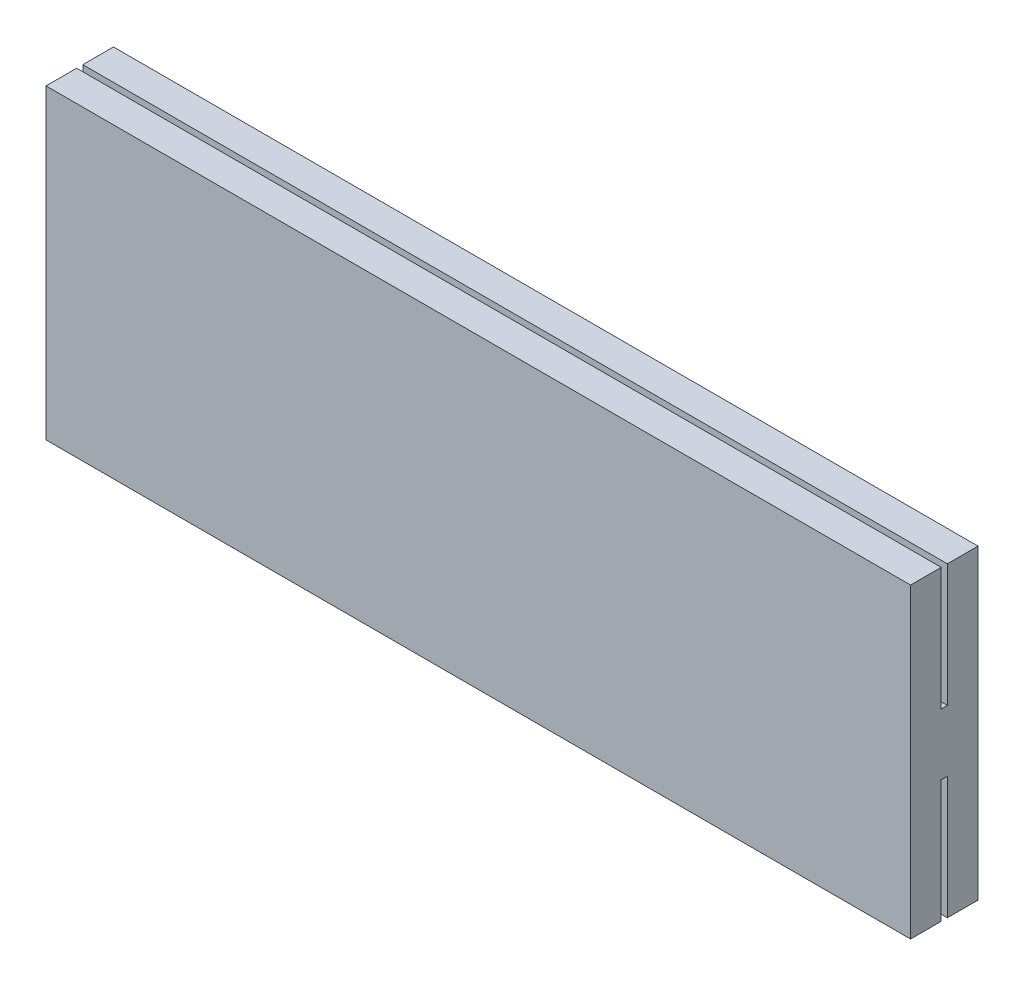
ISO-10303-21;
HEADER;
FILE_DESCRIPTION(('STEP AP214'),'2;1');
FILE_NAME('part.step','',(''),(''),'','','');
FILE_SCHEMA(('AUTOMOTIVE_DESIGN { 1 0 10303 214 1 1 1 1 }'));
ENDSEC;
DATA;
#1=APPLICATION_CONTEXT('core data for automotive mechanical design processes');
#2=APPLICATION_PROTOCOL_DEFINITION('international standard','automotive_design',2000,#1);
#3=PRODUCT_CONTEXT('',#1,'mechanical');
#4=PRODUCT('Part','Part','',(#3));
#5=PRODUCT_RELATED_PRODUCT_CATEGORY('part','',(#4));
#6=PRODUCT_DEFINITION_FORMATION('','',#4);
#7=PRODUCT_DEFINITION_CONTEXT('part definition',#1,'design');
#8=PRODUCT_DEFINITION('design','',#6,#7);
#9=PRODUCT_DEFINITION_SHAPE('','',#8);
#10=(LENGTH_UNIT() NAMED_UNIT(*) SI_UNIT(.MILLI.,.METRE.));
#11=(NAMED_UNIT(*) PLANE_ANGLE_UNIT() SI_UNIT($,.RADIAN.));
#12=(NAMED_UNIT(*) SI_UNIT($,.STERADIAN.) SOLID_ANGLE_UNIT());
#13=UNCERTAINTY_MEASURE_WITH_UNIT(LENGTH_MEASURE(1.E-05),#10,'distance_accuracy_value','');
#14=(GEOMETRIC_REPRESENTATION_CONTEXT(3) GLOBAL_UNCERTAINTY_ASSIGNED_CONTEXT((#13)) GLOBAL_UNIT_ASSIGNED_CONTEXT((#10,
#11,#12)) REPRESENTATION_CONTEXT('',''));
#15=CARTESIAN_POINT('',(0.,0.,0.));
#16=DIRECTION('',(0.,0.,1.));
#17=DIRECTION('',(1.,0.,0.));
#18=AXIS2_PLACEMENT_3D('',#15,#16,#17);
#19=CARTESIAN_POINT('',(293.391405889362,-240.,-12.));
#20=DIRECTION('',(0.,1.,0.));
#21=DIRECTION('',(0.,0.,1.));
#22=AXIS2_PLACEMENT_3D('',#19,#20,#21);
#23=PLANE('',#22);
#24=DIRECTION('',(1.,0.,0.));
#25=VECTOR('',#24,1.);
#26=CARTESIAN_POINT('',(293.391405889362,-240.,-2.00000000000019));
#27=LINE('',#26,#25);
#28=CARTESIAN_POINT('',(-141.,-240.,-2.00000000000176));
#29=VERTEX_POINT('',#28);
#30=CARTESIAN_POINT('',(141.,-240.,-2.00000000000019));
#31=VERTEX_POINT('',#30);
#32=EDGE_CURVE('E123',#29,#31,#27,.T.);
#33=ORIENTED_EDGE('',*,*,#32,.F.);
#34=DIRECTION('',(0.,0.,-1.));
#35=VECTOR('',#34,1.);
#36=CARTESIAN_POINT('',(-141.,-240.,-12.));
#37=LINE('',#36,#35);
#38=CARTESIAN_POINT('',(-141.,-240.,-12.));
#39=VERTEX_POINT('',#38);
#40=EDGE_CURVE('E176',#29,#39,#37,.T.);
#41=ORIENTED_EDGE('',*,*,#40,.T.);
#42=DIRECTION('',(-1.,0.,0.));
#43=VECTOR('',#42,1.);
#44=CARTESIAN_POINT('',(293.391405889362,-240.,-12.));
#45=LINE('',#44,#43);
#46=CARTESIAN_POINT('',(141.,-240.,-12.));
#47=VERTEX_POINT('',#46);
#48=EDGE_CURVE('E172',#47,#39,#45,.T.);
#49=ORIENTED_EDGE('',*,*,#48,.F.);
#50=DIRECTION('',(0.,0.,-1.));
#51=VECTOR('',#50,1.);
#52=CARTESIAN_POINT('',(141.,-240.,-12.));
#53=LINE('',#52,#51);
#54=EDGE_CURVE('E192',#31,#47,#53,.T.);
#55=ORIENTED_EDGE('',*,*,#54,.F.);
#56=EDGE_LOOP('',(#33,#41,#49,#55));
#57=FACE_BOUND('',#56,.T.);
#58=ADVANCED_FACE('F34',(#57),#23,.F.);
#59=CARTESIAN_POINT('',(293.391405889362,-140.,-12.));
#60=DIRECTION('',(0.,-1.,0.));
#61=DIRECTION('',(0.,0.,-1.));
#62=AXIS2_PLACEMENT_3D('',#59,#60,#61);
#63=PLANE('',#62);
#64=DIRECTION('',(-1.,0.,0.));
#65=VECTOR('',#64,1.);
#66=CARTESIAN_POINT('',(293.391405889362,-140.,-2.));
#67=LINE('',#66,#65);
#68=CARTESIAN_POINT('',(141.,-140.,-2.));
#69=VERTEX_POINT('',#68);
#70=CARTESIAN_POINT('',(-141.,-140.,-2.));
#71=VERTEX_POINT('',#70);
#72=EDGE_CURVE('E57',#69,#71,#67,.T.);
#73=ORIENTED_EDGE('',*,*,#72,.F.);
#74=DIRECTION('',(0.,0.,1.));
#75=VECTOR('',#74,1.);
#76=CARTESIAN_POINT('',(141.,-140.,-12.));
#77=LINE('',#76,#75);
#78=CARTESIAN_POINT('',(141.,-140.,-12.));
#79=VERTEX_POINT('',#78);
#80=EDGE_CURVE('E183',#79,#69,#77,.T.);
#81=ORIENTED_EDGE('',*,*,#80,.F.);
#82=DIRECTION('',(-1.,0.,0.));
#83=VECTOR('',#82,1.);
#84=CARTESIAN_POINT('',(293.391405889362,-140.,-12.));
#85=LINE('',#84,#83);
#86=CARTESIAN_POINT('',(-141.,-140.,-12.));
#87=VERTEX_POINT('',#86);
#88=EDGE_CURVE('E193',#79,#87,#85,.T.);
#89=ORIENTED_EDGE('',*,*,#88,.T.);
#90=DIRECTION('',(0.,0.,1.));
#91=VECTOR('',#90,1.);
#92=CARTESIAN_POINT('',(-141.,-140.,-12.));
#93=LINE('',#92,#91);
#94=EDGE_CURVE('E165',#87,#71,#93,.T.);
#95=ORIENTED_EDGE('',*,*,#94,.T.);
#96=EDGE_LOOP('',(#73,#81,#89,#95));
#97=FACE_BOUND('',#96,.T.);
#98=ADVANCED_FACE('F244',(#97),#63,.F.);
#99=CARTESIAN_POINT('',(293.391405889362,-140.,-12.));
#100=DIRECTION('',(0.,0.,1.));
#101=DIRECTION('',(0.,-1.,0.));
#102=AXIS2_PLACEMENT_3D('',#99,#100,#101);
#103=PLANE('',#102);
#104=DIRECTION('',(0.,1.,0.));
#105=VECTOR('',#104,1.);
#106=CARTESIAN_POINT('',(141.,-140.,-12.));
#107=LINE('',#106,#105);
#108=EDGE_CURVE('E187',#47,#79,#107,.T.);
#109=ORIENTED_EDGE('',*,*,#108,.F.);
#110=ORIENTED_EDGE('',*,*,#48,.T.);
#111=DIRECTION('',(0.,1.,0.));
#112=VECTOR('',#111,1.);
#113=CARTESIAN_POINT('',(-141.,-140.,-12.));
#114=LINE('',#113,#112);
#115=EDGE_CURVE('E169',#39,#87,#114,.T.);
#116=ORIENTED_EDGE('',*,*,#115,.T.);
#117=ORIENTED_EDGE('',*,*,#88,.F.);
#118=EDGE_LOOP('',(#109,#110,#116,#117));
#119=FACE_BOUND('',#118,.T.);
#120=ADVANCED_FACE('F248',(#119),#103,.F.);
#121=CARTESIAN_POINT('',(141.,-140.,0.));
#122=VERTEX_POINT('',#121);
#123=CARTESIAN_POINT('',(141.,-140.,9.99999999999998));
#124=VERTEX_POINT('',#123);
#125=EDGE_CURVE('E186',#122,#124,#77,.T.);
#126=ORIENTED_EDGE('',*,*,#125,.F.);
#127=DIRECTION('',(-1.,0.,0.));
#128=VECTOR('',#127,1.);
#129=CARTESIAN_POINT('',(293.391405889362,-140.,0.));
#130=LINE('',#129,#128);
#131=CARTESIAN_POINT('',(-141.,-140.,0.));
#132=VERTEX_POINT('',#131);
#133=EDGE_CURVE('E159',#122,#132,#130,.T.);
#134=ORIENTED_EDGE('',*,*,#133,.T.);
#135=CARTESIAN_POINT('',(-141.,-140.,9.99999999999998));
#136=VERTEX_POINT('',#135);
#137=EDGE_CURVE('E164',#132,#136,#93,.T.);
#138=ORIENTED_EDGE('',*,*,#137,.T.);
#139=DIRECTION('',(-1.,0.,0.));
#140=VECTOR('',#139,1.);
#141=CARTESIAN_POINT('',(293.391405889362,-140.,9.99999999999998));
#142=LINE('',#141,#140);
#143=EDGE_CURVE('E195',#124,#136,#142,.T.);
#144=ORIENTED_EDGE('',*,*,#143,.F.);
#145=EDGE_LOOP('',(#126,#134,#138,#144));
#146=FACE_BOUND('',#145,.T.);
#147=ADVANCED_FACE('F232',(#146),#63,.F.);
#148=CARTESIAN_POINT('',(293.391405889362,-140.,9.99999999999998));
#149=DIRECTION('',(0.,0.,-1.));
#150=DIRECTION('',(0.,1.,0.));
#151=AXIS2_PLACEMENT_3D('',#148,#149,#150);
#152=PLANE('',#151);
#153=DIRECTION('',(0.,-1.,0.));
#154=VECTOR('',#153,1.);
#155=CARTESIAN_POINT('',(141.,-140.,9.99999999999998));
#156=LINE('',#155,#154);
#157=CARTESIAN_POINT('',(141.,-240.,9.99999999999995));
#158=VERTEX_POINT('',#157);
#159=EDGE_CURVE('E179',#124,#158,#156,.T.);
#160=ORIENTED_EDGE('',*,*,#159,.F.);
#161=ORIENTED_EDGE('',*,*,#143,.T.);
#162=DIRECTION('',(0.,-1.,0.));
#163=VECTOR('',#162,1.);
#164=CARTESIAN_POINT('',(-141.,-140.,9.99999999999998));
#165=LINE('',#164,#163);
#166=CARTESIAN_POINT('',(-141.,-240.,9.99999999999995));
#167=VERTEX_POINT('',#166);
#168=EDGE_CURVE('E168',#136,#167,#165,.T.);
#169=ORIENTED_EDGE('',*,*,#168,.T.);
#170=DIRECTION('',(-1.,0.,0.));
#171=VECTOR('',#170,1.);
#172=CARTESIAN_POINT('',(293.391405889362,-240.,9.99999999999995));
#173=LINE('',#172,#171);
#174=EDGE_CURVE('E198',#158,#167,#173,.T.);
#175=ORIENTED_EDGE('',*,*,#174,.F.);
#176=EDGE_LOOP('',(#160,#161,#169,#175));
#177=FACE_BOUND('',#176,.T.);
#178=ADVANCED_FACE('F225',(#177),#152,.F.);
#179=CARTESIAN_POINT('',(-141.,-240.,-1.89163709932799E-13));
#180=VERTEX_POINT('',#179);
#181=EDGE_CURVE('E173',#167,#180,#37,.T.);
#182=ORIENTED_EDGE('',*,*,#181,.T.);
#183=DIRECTION('',(1.,0.,0.));
#184=VECTOR('',#183,1.);
#185=CARTESIAN_POINT('',(293.391405889362,-240.,-1.90819582357449E-13));
#186=LINE('',#185,#184);
#187=CARTESIAN_POINT('',(141.,-240.,-1.90819586702168E-13));
#188=VERTEX_POINT('',#187);
#189=EDGE_CURVE('E140',#180,#188,#186,.T.);
#190=ORIENTED_EDGE('',*,*,#189,.T.);
#191=EDGE_CURVE('E190',#158,#188,#53,.T.);
#192=ORIENTED_EDGE('',*,*,#191,.F.);
#193=ORIENTED_EDGE('',*,*,#174,.T.);
#194=EDGE_LOOP('',(#182,#190,#192,#193));
#195=FACE_BOUND('',#194,.T.);
#196=ADVANCED_FACE('F221',(#195),#23,.F.);
#197=CARTESIAN_POINT('',(141.,-180.,-2.));
#198=DIRECTION('',(1.,0.,0.));
#199=DIRECTION('',(0.,0.,-1.));
#200=AXIS2_PLACEMENT_3D('',#197,#198,#199);
#201=PLANE('',#200);
#202=DIRECTION('',(0.,-1.,0.));
#203=VECTOR('',#202,1.);
#204=CARTESIAN_POINT('',(141.,-180.,0.));
#205=LINE('',#204,#203);
#206=CARTESIAN_POINT('',(141.,-200.,0.));
#207=VERTEX_POINT('',#206);
#208=EDGE_CURVE('E139',#207,#188,#205,.T.);
#209=ORIENTED_EDGE('',*,*,#208,.F.);
#210=DIRECTION('',(0.,0.,1.));
#211=VECTOR('',#210,1.);
#212=CARTESIAN_POINT('',(141.,-200.,-2.00000000000008));
#213=LINE('',#212,#211);
#214=CARTESIAN_POINT('',(141.,-200.,-2.00000000000004));
#215=VERTEX_POINT('',#214);
#216=EDGE_CURVE('E127',#215,#207,#213,.T.);
#217=ORIENTED_EDGE('',*,*,#216,.F.);
#218=DIRECTION('',(0.,-1.,0.));
#219=VECTOR('',#218,1.);
#220=CARTESIAN_POINT('',(141.,-180.,-2.));
#221=LINE('',#220,#219);
#222=EDGE_CURVE('E120',#215,#31,#221,.T.);
#223=ORIENTED_EDGE('',*,*,#222,.T.);
#224=ORIENTED_EDGE('',*,*,#54,.T.);
#225=ORIENTED_EDGE('',*,*,#108,.T.);
#226=ORIENTED_EDGE('',*,*,#80,.T.);
#227=DIRECTION('',(0.,-1.,0.));
#228=VECTOR('',#227,1.);
#229=CARTESIAN_POINT('',(141.,-180.,-2.));
#230=LINE('',#229,#228);
#231=CARTESIAN_POINT('',(141.,-180.,-2.));
#232=VERTEX_POINT('',#231);
#233=EDGE_CURVE('E154',#69,#232,#230,.T.);
#234=ORIENTED_EDGE('',*,*,#233,.T.);
#235=DIRECTION('',(0.,0.,-1.));
#236=VECTOR('',#235,1.);
#237=CARTESIAN_POINT('',(141.,-180.,-2.));
#238=LINE('',#237,#236);
#239=CARTESIAN_POINT('',(141.,-180.,0.));
#240=VERTEX_POINT('',#239);
#241=EDGE_CURVE('E157',#240,#232,#238,.T.);
#242=ORIENTED_EDGE('',*,*,#241,.F.);
#243=DIRECTION('',(0.,-1.,0.));
#244=VECTOR('',#243,1.);
#245=CARTESIAN_POINT('',(141.,-180.,0.));
#246=LINE('',#245,#244);
#247=EDGE_CURVE('E162',#122,#240,#246,.T.);
#248=ORIENTED_EDGE('',*,*,#247,.F.);
#249=ORIENTED_EDGE('',*,*,#125,.T.);
#250=ORIENTED_EDGE('',*,*,#159,.T.);
#251=ORIENTED_EDGE('',*,*,#191,.T.);
#252=EDGE_LOOP('',(#209,#217,#223,#224,#225,#226,#234,#242,#248,#249,#250,#251));
#253=FACE_BOUND('',#252,.T.);
#254=ADVANCED_FACE('F36',(#253),#201,.T.);
#255=CARTESIAN_POINT('',(-141.,225.,-2.));
#256=DIRECTION('',(-1.,0.,0.));
#257=DIRECTION('',(0.,0.,1.));
#258=AXIS2_PLACEMENT_3D('',#255,#256,#257);
#259=PLANE('',#258);
#260=DIRECTION('',(0.,1.,0.));
#261=VECTOR('',#260,1.);
#262=CARTESIAN_POINT('',(-141.,225.,1.570792107497E-12));
#263=LINE('',#262,#261);
#264=CARTESIAN_POINT('',(-141.,-200.,0.));
#265=VERTEX_POINT('',#264);
#266=EDGE_CURVE('E11',#180,#265,#263,.T.);
#267=ORIENTED_EDGE('',*,*,#266,.F.);
#268=ORIENTED_EDGE('',*,*,#181,.F.);
#269=ORIENTED_EDGE('',*,*,#168,.F.);
#270=ORIENTED_EDGE('',*,*,#137,.F.);
#271=DIRECTION('',(0.,1.,0.));
#272=VECTOR('',#271,1.);
#273=CARTESIAN_POINT('',(-141.,225.,0.));
#274=LINE('',#273,#272);
#275=CARTESIAN_POINT('',(-141.,-180.,0.));
#276=VERTEX_POINT('',#275);
#277=EDGE_CURVE('E205',#276,#132,#274,.T.);
#278=ORIENTED_EDGE('',*,*,#277,.F.);
#279=DIRECTION('',(0.,0.,1.));
#280=VECTOR('',#279,1.);
#281=CARTESIAN_POINT('',(-141.,-180.,-2.));
#282=LINE('',#281,#280);
#283=CARTESIAN_POINT('',(-141.,-180.,-2.));
#284=VERTEX_POINT('',#283);
#285=EDGE_CURVE('E203',#284,#276,#282,.T.);
#286=ORIENTED_EDGE('',*,*,#285,.F.);
#287=DIRECTION('',(0.,1.,0.));
#288=VECTOR('',#287,1.);
#289=CARTESIAN_POINT('',(-141.,225.,-2.));
#290=LINE('',#289,#288);
#291=EDGE_CURVE('E182',#284,#71,#290,.T.);
#292=ORIENTED_EDGE('',*,*,#291,.T.);
#293=ORIENTED_EDGE('',*,*,#94,.F.);
#294=ORIENTED_EDGE('',*,*,#115,.F.);
#295=ORIENTED_EDGE('',*,*,#40,.F.);
#296=DIRECTION('',(0.,1.,0.));
#297=VECTOR('',#296,1.);
#298=CARTESIAN_POINT('',(-141.,225.,-2.));
#299=LINE('',#298,#297);
#300=CARTESIAN_POINT('',(-141.,-200.,-2.00000000000161));
#301=VERTEX_POINT('',#300);
#302=EDGE_CURVE('E207',#29,#301,#299,.T.);
#303=ORIENTED_EDGE('',*,*,#302,.T.);
#304=DIRECTION('',(0.,0.,-1.));
#305=VECTOR('',#304,1.);
#306=CARTESIAN_POINT('',(-141.,-200.,-2.00000000000161));
#307=LINE('',#306,#305);
#308=EDGE_CURVE('E42',#265,#301,#307,.T.);
#309=ORIENTED_EDGE('',*,*,#308,.F.);
#310=EDGE_LOOP('',(#267,#268,#269,#270,#278,#286,#292,#293,#294,#295,#303,#309));
#311=FACE_BOUND('',#310,.T.);
#312=ADVANCED_FACE('F211',(#311),#259,.T.);
#313=CARTESIAN_POINT('',(0.,0.,0.));
#314=DIRECTION('',(0.,0.,1.));
#315=DIRECTION('',(1.,0.,0.));
#316=AXIS2_PLACEMENT_3D('',#313,#314,#315);
#317=PLANE('',#316);
#318=ORIENTED_EDGE('',*,*,#247,.T.);
#319=DIRECTION('',(1.,0.,0.));
#320=VECTOR('',#319,1.);
#321=CARTESIAN_POINT('',(-191.,-180.,0.));
#322=LINE('',#321,#320);
#323=EDGE_CURVE('E147',#276,#240,#322,.T.);
#324=ORIENTED_EDGE('',*,*,#323,.F.);
#325=ORIENTED_EDGE('',*,*,#277,.T.);
#326=ORIENTED_EDGE('',*,*,#133,.F.);
#327=EDGE_LOOP('',(#318,#324,#325,#326));
#328=FACE_BOUND('',#327,.T.);
#329=ADVANCED_FACE('F235',(#328),#317,.F.);
#330=CARTESIAN_POINT('',(-191.,-180.,-2.));
#331=DIRECTION('',(0.,-1.,0.));
#332=DIRECTION('',(0.,0.,1.));
#333=AXIS2_PLACEMENT_3D('',#330,#331,#332);
#334=PLANE('',#333);
#335=ORIENTED_EDGE('',*,*,#241,.T.);
#336=DIRECTION('',(1.,0.,0.));
#337=VECTOR('',#336,1.);
#338=CARTESIAN_POINT('',(-191.,-180.,-2.));
#339=LINE('',#338,#337);
#340=EDGE_CURVE('E148',#284,#232,#339,.T.);
#341=ORIENTED_EDGE('',*,*,#340,.F.);
#342=ORIENTED_EDGE('',*,*,#285,.T.);
#343=ORIENTED_EDGE('',*,*,#323,.T.);
#344=EDGE_LOOP('',(#335,#341,#342,#343));
#345=FACE_BOUND('',#344,.T.);
#346=ADVANCED_FACE('F240',(#345),#334,.F.);
#347=CARTESIAN_POINT('',(0.,0.,-2.));
#348=DIRECTION('',(0.,0.,1.));
#349=DIRECTION('',(1.,0.,0.));
#350=AXIS2_PLACEMENT_3D('',#347,#348,#349);
#351=PLANE('',#350);
#352=ORIENTED_EDGE('',*,*,#72,.T.);
#353=ORIENTED_EDGE('',*,*,#291,.F.);
#354=ORIENTED_EDGE('',*,*,#340,.T.);
#355=ORIENTED_EDGE('',*,*,#233,.F.);
#356=EDGE_LOOP('',(#352,#353,#354,#355));
#357=FACE_BOUND('',#356,.T.);
#358=ADVANCED_FACE('F241',(#357),#351,.T.);
#359=CARTESIAN_POINT('',(0.,-380.,-7.19121731859478E-13));
#360=DIRECTION('',(0.,0.,1.));
#361=DIRECTION('',(1.,0.,0.));
#362=AXIS2_PLACEMENT_3D('',#359,#360,#361);
#363=PLANE('',#362);
#364=ORIENTED_EDGE('',*,*,#208,.T.);
#365=ORIENTED_EDGE('',*,*,#189,.F.);
#366=ORIENTED_EDGE('',*,*,#266,.T.);
#367=DIRECTION('',(1.,0.,0.));
#368=VECTOR('',#367,1.);
#369=CARTESIAN_POINT('',(-191.,-200.,0.));
#370=LINE('',#369,#368);
#371=EDGE_CURVE('E135',#265,#207,#370,.T.);
#372=ORIENTED_EDGE('',*,*,#371,.T.);
#373=EDGE_LOOP('',(#364,#365,#366,#372));
#374=FACE_BOUND('',#373,.T.);
#375=ADVANCED_FACE('F217',(#374),#363,.F.);
#376=CARTESIAN_POINT('',(-191.,-200.,-2.00000000000004));
#377=DIRECTION('',(0.,1.,0.));
#378=DIRECTION('',(0.,0.,1.));
#379=AXIS2_PLACEMENT_3D('',#376,#377,#378);
#380=PLANE('',#379);
#381=ORIENTED_EDGE('',*,*,#216,.T.);
#382=ORIENTED_EDGE('',*,*,#371,.F.);
#383=ORIENTED_EDGE('',*,*,#308,.T.);
#384=DIRECTION('',(1.,0.,0.));
#385=VECTOR('',#384,1.);
#386=CARTESIAN_POINT('',(-191.,-200.,-2.00000000000004));
#387=LINE('',#386,#385);
#388=EDGE_CURVE('E49',#301,#215,#387,.T.);
#389=ORIENTED_EDGE('',*,*,#388,.T.);
#390=EDGE_LOOP('',(#381,#382,#383,#389));
#391=FACE_BOUND('',#390,.T.);
#392=ADVANCED_FACE('F130',(#391),#380,.F.);
#393=CARTESIAN_POINT('',(0.,-380.,-2.00000000000072));
#394=DIRECTION('',(0.,0.,1.));
#395=DIRECTION('',(1.,0.,0.));
#396=AXIS2_PLACEMENT_3D('',#393,#394,#395);
#397=PLANE('',#396);
#398=ORIENTED_EDGE('',*,*,#388,.F.);
#399=ORIENTED_EDGE('',*,*,#302,.F.);
#400=ORIENTED_EDGE('',*,*,#32,.T.);
#401=ORIENTED_EDGE('',*,*,#222,.F.);
#402=EDGE_LOOP('',(#398,#399,#400,#401));
#403=FACE_BOUND('',#402,.T.);
#404=ADVANCED_FACE('F121',(#403),#397,.T.);
#405=CLOSED_SHELL('',(#58,#98,#120,#147,#178,#196,#254,#312,#329,#346,#358,#375,#392,#404));
#406=MANIFOLD_SOLID_BREP('B2',#405);
#407=ADVANCED_BREP_SHAPE_REPRESENTATION('',(#18,#406),#14);
#408=SHAPE_DEFINITION_REPRESENTATION(#9,#407);
ENDSEC;
END-ISO-10303-21;
